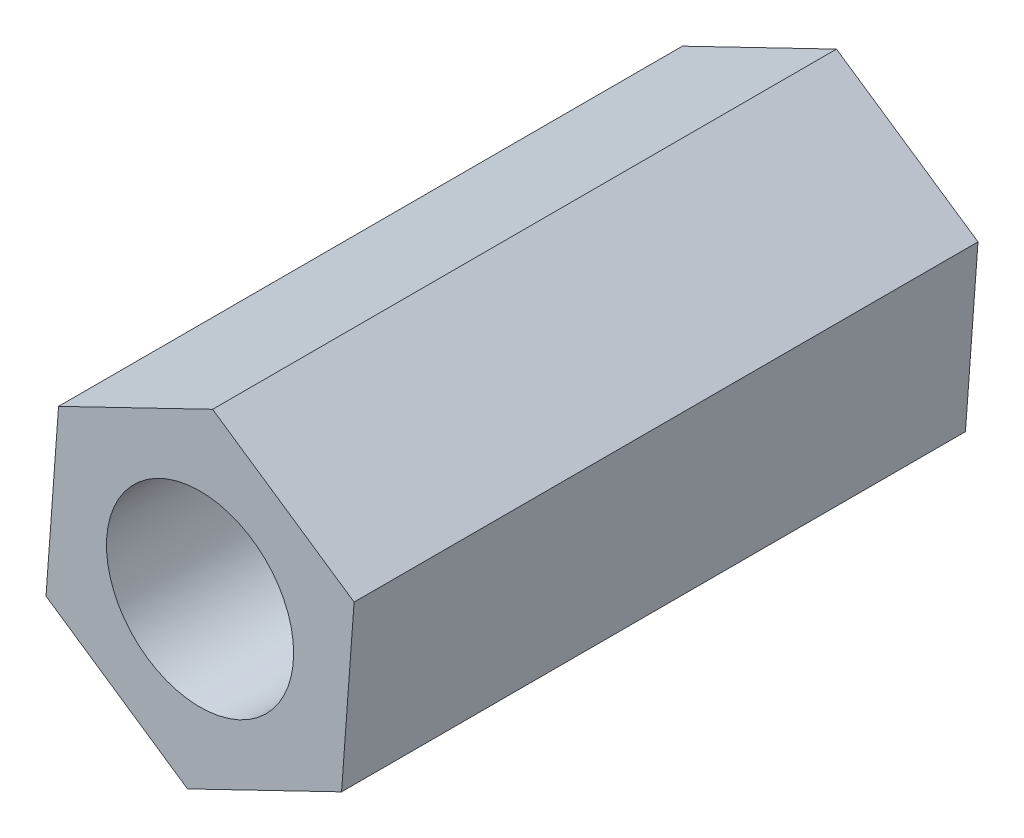
ISO-10303-21;
HEADER;
FILE_DESCRIPTION(('STEP AP214'),'2;1');
FILE_NAME('part.step','',(''),(''),'','','');
FILE_SCHEMA(('AUTOMOTIVE_DESIGN { 1 0 10303 214 1 1 1 1 }'));
ENDSEC;
DATA;
#1=APPLICATION_CONTEXT('core data for automotive mechanical design processes');
#2=APPLICATION_PROTOCOL_DEFINITION('international standard','automotive_design',2000,#1);
#3=PRODUCT_CONTEXT('',#1,'mechanical');
#4=PRODUCT('Part','Part','',(#3));
#5=PRODUCT_RELATED_PRODUCT_CATEGORY('part','',(#4));
#6=PRODUCT_DEFINITION_FORMATION('','',#4);
#7=PRODUCT_DEFINITION_CONTEXT('part definition',#1,'design');
#8=PRODUCT_DEFINITION('design','',#6,#7);
#9=PRODUCT_DEFINITION_SHAPE('','',#8);
#10=(LENGTH_UNIT() NAMED_UNIT(*) SI_UNIT(.MILLI.,.METRE.));
#11=(NAMED_UNIT(*) PLANE_ANGLE_UNIT() SI_UNIT($,.RADIAN.));
#12=(NAMED_UNIT(*) SI_UNIT($,.STERADIAN.) SOLID_ANGLE_UNIT());
#13=UNCERTAINTY_MEASURE_WITH_UNIT(LENGTH_MEASURE(1.E-05),#10,'distance_accuracy_value','');
#14=(GEOMETRIC_REPRESENTATION_CONTEXT(3) GLOBAL_UNCERTAINTY_ASSIGNED_CONTEXT((#13)) GLOBAL_UNIT_ASSIGNED_CONTEXT((#10,
#11,#12)) REPRESENTATION_CONTEXT('',''));
#15=CARTESIAN_POINT('',(0.,0.,0.));
#16=DIRECTION('',(0.,0.,1.));
#17=DIRECTION('',(1.,0.,0.));
#18=AXIS2_PLACEMENT_3D('',#15,#16,#17);
#19=CARTESIAN_POINT('',(-0.80405781744383,-10.9401473646172,-40.));
#20=DIRECTION('',(0.435176779617796,-0.900345028575981,0.));
#21=DIRECTION('',(0.900345028575981,0.435176779617796,0.));
#22=AXIS2_PLACEMENT_3D('',#19,#20,#21);
#23=PLANE('',#22);
#24=DIRECTION('',(0.900345028575981,0.435176779617796,0.));
#25=VECTOR('',#24,1.);
#26=CARTESIAN_POINT('',(-0.80405781744383,-10.9401473646172,0.));
#27=LINE('',#26,#25);
#28=CARTESIAN_POINT('',(-0.80405781744383,-10.9401473646172,0.));
#29=VERTEX_POINT('',#28);
#30=CARTESIAN_POINT('',(9.07241663018197,-6.16640817832643,0.));
#31=VERTEX_POINT('',#30);
#32=EDGE_CURVE('E120',#29,#31,#27,.T.);
#33=ORIENTED_EDGE('',*,*,#32,.F.);
#34=DIRECTION('',(0.,0.,1.));
#35=VECTOR('',#34,1.);
#36=CARTESIAN_POINT('',(-0.80405781744383,-10.9401473646172,-40.));
#37=LINE('',#36,#35);
#38=CARTESIAN_POINT('',(-0.80405781744383,-10.9401473646172,-40.));
#39=VERTEX_POINT('',#38);
#40=EDGE_CURVE('E11',#39,#29,#37,.T.);
#41=ORIENTED_EDGE('',*,*,#40,.F.);
#42=DIRECTION('',(0.900345028575981,0.435176779617796,0.));
#43=VECTOR('',#42,1.);
#44=CARTESIAN_POINT('',(-0.80405781744383,-10.9401473646172,-40.));
#45=LINE('',#44,#43);
#46=CARTESIAN_POINT('',(9.07241663018197,-6.16640817832643,-40.));
#47=VERTEX_POINT('',#46);
#48=EDGE_CURVE('E135',#39,#47,#45,.T.);
#49=ORIENTED_EDGE('',*,*,#48,.T.);
#50=DIRECTION('',(0.,0.,1.));
#51=VECTOR('',#50,1.);
#52=CARTESIAN_POINT('',(9.07241663018197,-6.16640817832643,-40.));
#53=LINE('',#52,#51);
#54=EDGE_CURVE('E38',#47,#31,#53,.T.);
#55=ORIENTED_EDGE('',*,*,#54,.T.);
#56=EDGE_LOOP('',(#33,#41,#49,#55));
#57=FACE_BOUND('',#56,.T.);
#58=ADVANCED_FACE('F35',(#57),#23,.T.);
#59=CARTESIAN_POINT('',(-9.87647444762579,-4.77373918629077,-40.));
#60=DIRECTION('',(-0.562133277108928,-0.827046660574104,0.));
#61=DIRECTION('',(0.827046660574104,-0.562133277108928,0.));
#62=AXIS2_PLACEMENT_3D('',#59,#60,#61);
#63=PLANE('',#62);
#64=DIRECTION('',(0.827046660574104,-0.562133277108928,0.));
#65=VECTOR('',#64,1.);
#66=CARTESIAN_POINT('',(-9.87647444762579,-4.77373918629077,0.));
#67=LINE('',#66,#65);
#68=CARTESIAN_POINT('',(-9.87647444762579,-4.77373918629077,0.));
#69=VERTEX_POINT('',#68);
#70=EDGE_CURVE('E133',#69,#29,#67,.T.);
#71=ORIENTED_EDGE('',*,*,#70,.F.);
#72=DIRECTION('',(0.,0.,1.));
#73=VECTOR('',#72,1.);
#74=CARTESIAN_POINT('',(-9.87647444762579,-4.77373918629077,-40.));
#75=LINE('',#74,#73);
#76=CARTESIAN_POINT('',(-9.87647444762579,-4.77373918629077,-40.));
#77=VERTEX_POINT('',#76);
#78=EDGE_CURVE('E44',#77,#69,#75,.T.);
#79=ORIENTED_EDGE('',*,*,#78,.F.);
#80=DIRECTION('',(0.827046660574104,-0.562133277108928,0.));
#81=VECTOR('',#80,1.);
#82=CARTESIAN_POINT('',(-9.87647444762579,-4.77373918629077,-40.));
#83=LINE('',#82,#81);
#84=EDGE_CURVE('E110',#77,#39,#83,.T.);
#85=ORIENTED_EDGE('',*,*,#84,.T.);
#86=ORIENTED_EDGE('',*,*,#40,.T.);
#87=EDGE_LOOP('',(#71,#79,#85,#86));
#88=FACE_BOUND('',#87,.T.);
#89=ADVANCED_FACE('F143',(#88),#63,.T.);
#90=CARTESIAN_POINT('',(-9.07241663018197,6.16640817832643,-40.));
#91=DIRECTION('',(-0.997310056726724,0.0732983680018764,0.));
#92=DIRECTION('',(-0.0732983680018764,-0.997310056726724,0.));
#93=AXIS2_PLACEMENT_3D('',#90,#91,#92);
#94=PLANE('',#93);
#95=DIRECTION('',(-0.0732983680018764,-0.997310056726724,0.));
#96=VECTOR('',#95,1.);
#97=CARTESIAN_POINT('',(-9.07241663018197,6.16640817832643,0.));
#98=LINE('',#97,#96);
#99=CARTESIAN_POINT('',(-9.07241663018197,6.16640817832643,0.));
#100=VERTEX_POINT('',#99);
#101=EDGE_CURVE('E97',#100,#69,#98,.T.);
#102=ORIENTED_EDGE('',*,*,#101,.F.);
#103=DIRECTION('',(0.,0.,1.));
#104=VECTOR('',#103,1.);
#105=CARTESIAN_POINT('',(-9.07241663018197,6.16640817832643,-40.));
#106=LINE('',#105,#104);
#107=CARTESIAN_POINT('',(-9.07241663018197,6.16640817832643,-40.));
#108=VERTEX_POINT('',#107);
#109=EDGE_CURVE('E92',#108,#100,#106,.T.);
#110=ORIENTED_EDGE('',*,*,#109,.F.);
#111=DIRECTION('',(-0.0732983680018764,-0.997310056726724,0.));
#112=VECTOR('',#111,1.);
#113=CARTESIAN_POINT('',(-9.07241663018197,6.16640817832643,-40.));
#114=LINE('',#113,#112);
#115=EDGE_CURVE('E95',#108,#77,#114,.T.);
#116=ORIENTED_EDGE('',*,*,#115,.T.);
#117=ORIENTED_EDGE('',*,*,#78,.T.);
#118=EDGE_LOOP('',(#102,#110,#116,#117));
#119=FACE_BOUND('',#118,.T.);
#120=ADVANCED_FACE('F94',(#119),#94,.T.);
#121=CARTESIAN_POINT('',(0.804057817443834,10.9401473646172,-40.));
#122=DIRECTION('',(-0.435176779617796,0.900345028575981,0.));
#123=DIRECTION('',(-0.900345028575981,-0.435176779617796,0.));
#124=AXIS2_PLACEMENT_3D('',#121,#122,#123);
#125=PLANE('',#124);
#126=DIRECTION('',(-0.900345028575981,-0.435176779617796,0.));
#127=VECTOR('',#126,1.);
#128=CARTESIAN_POINT('',(0.804057817443834,10.9401473646172,0.));
#129=LINE('',#128,#127);
#130=CARTESIAN_POINT('',(0.804057817443834,10.9401473646172,0.));
#131=VERTEX_POINT('',#130);
#132=EDGE_CURVE('E130',#131,#100,#129,.T.);
#133=ORIENTED_EDGE('',*,*,#132,.F.);
#134=DIRECTION('',(0.,0.,1.));
#135=VECTOR('',#134,1.);
#136=CARTESIAN_POINT('',(0.804057817443834,10.9401473646172,-40.));
#137=LINE('',#136,#135);
#138=CARTESIAN_POINT('',(0.804057817443834,10.9401473646172,-40.));
#139=VERTEX_POINT('',#138);
#140=EDGE_CURVE('E102',#139,#131,#137,.T.);
#141=ORIENTED_EDGE('',*,*,#140,.F.);
#142=DIRECTION('',(-0.900345028575981,-0.435176779617796,0.));
#143=VECTOR('',#142,1.);
#144=CARTESIAN_POINT('',(0.804057817443834,10.9401473646172,-40.));
#145=LINE('',#144,#143);
#146=EDGE_CURVE('E108',#139,#108,#145,.T.);
#147=ORIENTED_EDGE('',*,*,#146,.T.);
#148=ORIENTED_EDGE('',*,*,#109,.T.);
#149=EDGE_LOOP('',(#133,#141,#147,#148));
#150=FACE_BOUND('',#149,.T.);
#151=ADVANCED_FACE('F112',(#150),#125,.T.);
#152=CARTESIAN_POINT('',(9.87647444762579,4.77373918629078,-40.));
#153=DIRECTION('',(0.562133277108927,0.827046660574104,0.));
#154=DIRECTION('',(-0.827046660574104,0.562133277108928,0.));
#155=AXIS2_PLACEMENT_3D('',#152,#153,#154);
#156=PLANE('',#155);
#157=DIRECTION('',(-0.827046660574104,0.562133277108927,0.));
#158=VECTOR('',#157,1.);
#159=CARTESIAN_POINT('',(9.87647444762579,4.77373918629078,0.));
#160=LINE('',#159,#158);
#161=CARTESIAN_POINT('',(9.87647444762579,4.77373918629078,0.));
#162=VERTEX_POINT('',#161);
#163=EDGE_CURVE('E127',#162,#131,#160,.T.);
#164=ORIENTED_EDGE('',*,*,#163,.F.);
#165=DIRECTION('',(0.,0.,1.));
#166=VECTOR('',#165,1.);
#167=CARTESIAN_POINT('',(9.87647444762579,4.77373918629078,-40.));
#168=LINE('',#167,#166);
#169=CARTESIAN_POINT('',(9.87647444762579,4.77373918629078,-40.));
#170=VERTEX_POINT('',#169);
#171=EDGE_CURVE('E138',#170,#162,#168,.T.);
#172=ORIENTED_EDGE('',*,*,#171,.F.);
#173=DIRECTION('',(-0.827046660574104,0.562133277108927,0.));
#174=VECTOR('',#173,1.);
#175=CARTESIAN_POINT('',(9.87647444762579,4.77373918629078,-40.));
#176=LINE('',#175,#174);
#177=EDGE_CURVE('E113',#170,#139,#176,.T.);
#178=ORIENTED_EDGE('',*,*,#177,.T.);
#179=ORIENTED_EDGE('',*,*,#140,.T.);
#180=EDGE_LOOP('',(#164,#172,#178,#179));
#181=FACE_BOUND('',#180,.T.);
#182=ADVANCED_FACE('F156',(#181),#156,.T.);
#183=CARTESIAN_POINT('',(9.07241663018197,-6.16640817832643,-40.));
#184=DIRECTION('',(0.997310056726724,-0.0732983680018762,0.));
#185=DIRECTION('',(0.0732983680018762,0.997310056726724,0.));
#186=AXIS2_PLACEMENT_3D('',#183,#184,#185);
#187=PLANE('',#186);
#188=DIRECTION('',(0.0732983680018762,0.997310056726724,0.));
#189=VECTOR('',#188,1.);
#190=CARTESIAN_POINT('',(9.07241663018197,-6.16640817832643,0.));
#191=LINE('',#190,#189);
#192=EDGE_CURVE('E123',#31,#162,#191,.T.);
#193=ORIENTED_EDGE('',*,*,#192,.F.);
#194=ORIENTED_EDGE('',*,*,#54,.F.);
#195=DIRECTION('',(0.0732983680018762,0.997310056726724,0.));
#196=VECTOR('',#195,1.);
#197=CARTESIAN_POINT('',(9.07241663018197,-6.16640817832643,-40.));
#198=LINE('',#197,#196);
#199=EDGE_CURVE('E115',#47,#170,#198,.T.);
#200=ORIENTED_EDGE('',*,*,#199,.T.);
#201=ORIENTED_EDGE('',*,*,#171,.T.);
#202=EDGE_LOOP('',(#193,#194,#200,#201));
#203=FACE_BOUND('',#202,.T.);
#204=ADVANCED_FACE('F140',(#203),#187,.T.);
#205=CARTESIAN_POINT('',(0.,0.,-40.));
#206=DIRECTION('',(0.,0.,1.));
#207=DIRECTION('',(1.,0.,0.));
#208=AXIS2_PLACEMENT_3D('',#205,#206,#207);
#209=PLANE('',#208);
#210=CARTESIAN_POINT('',(0.,0.,-40.));
#211=DIRECTION('',(0.,0.,1.));
#212=DIRECTION('',(1.,0.,0.));
#213=AXIS2_PLACEMENT_3D('',#210,#211,#212);
#214=CIRCLE('',#213,6.);
#215=CARTESIAN_POINT('',(6.,0.,-40.));
#216=VERTEX_POINT('',#215);
#217=EDGE_CURVE('E124',#216,#216,#214,.T.);
#218=ORIENTED_EDGE('',*,*,#217,.T.);
#219=EDGE_LOOP('',(#218));
#220=FACE_BOUND('',#219,.T.);
#221=ORIENTED_EDGE('',*,*,#48,.F.);
#222=ORIENTED_EDGE('',*,*,#84,.F.);
#223=ORIENTED_EDGE('',*,*,#115,.F.);
#224=ORIENTED_EDGE('',*,*,#146,.F.);
#225=ORIENTED_EDGE('',*,*,#177,.F.);
#226=ORIENTED_EDGE('',*,*,#199,.F.);
#227=EDGE_LOOP('',(#221,#222,#223,#224,#225,#226));
#228=FACE_BOUND('',#227,.T.);
#229=ADVANCED_FACE('F106',(#220,#228),#209,.F.);
#230=CARTESIAN_POINT('',(0.,0.,0.));
#231=DIRECTION('',(0.,0.,1.));
#232=DIRECTION('',(1.,0.,0.));
#233=AXIS2_PLACEMENT_3D('',#230,#231,#232);
#234=PLANE('',#233);
#235=CARTESIAN_POINT('',(0.,0.,0.));
#236=DIRECTION('',(0.,0.,1.));
#237=DIRECTION('',(1.,0.,0.));
#238=AXIS2_PLACEMENT_3D('',#235,#236,#237);
#239=CIRCLE('',#238,6.);
#240=CARTESIAN_POINT('',(6.,0.,0.));
#241=VERTEX_POINT('',#240);
#242=EDGE_CURVE('E179',#241,#241,#239,.T.);
#243=ORIENTED_EDGE('',*,*,#242,.F.);
#244=EDGE_LOOP('',(#243));
#245=FACE_BOUND('',#244,.T.);
#246=ORIENTED_EDGE('',*,*,#32,.T.);
#247=ORIENTED_EDGE('',*,*,#192,.T.);
#248=ORIENTED_EDGE('',*,*,#163,.T.);
#249=ORIENTED_EDGE('',*,*,#132,.T.);
#250=ORIENTED_EDGE('',*,*,#101,.T.);
#251=ORIENTED_EDGE('',*,*,#70,.T.);
#252=EDGE_LOOP('',(#246,#247,#248,#249,#250,#251));
#253=FACE_BOUND('',#252,.T.);
#254=ADVANCED_FACE('F142',(#245,#253),#234,.T.);
#255=CARTESIAN_POINT('',(0.,0.,-40.));
#256=DIRECTION('',(0.,0.,1.));
#257=DIRECTION('',(1.,0.,0.));
#258=AXIS2_PLACEMENT_3D('',#255,#256,#257);
#259=CYLINDRICAL_SURFACE('',#258,6.);
#260=ORIENTED_EDGE('',*,*,#217,.F.);
#261=EDGE_LOOP('',(#260));
#262=FACE_BOUND('',#261,.T.);
#263=ORIENTED_EDGE('',*,*,#242,.T.);
#264=EDGE_LOOP('',(#263));
#265=FACE_BOUND('',#264,.T.);
#266=ADVANCED_FACE('F167',(#262,#265),#259,.F.);
#267=CLOSED_SHELL('',(#58,#89,#120,#151,#182,#204,#229,#254,#266));
#268=MANIFOLD_SOLID_BREP('B2',#267);
#269=ADVANCED_BREP_SHAPE_REPRESENTATION('',(#18,#268),#14);
#270=SHAPE_DEFINITION_REPRESENTATION(#9,#269);
ENDSEC;
END-ISO-10303-21;
